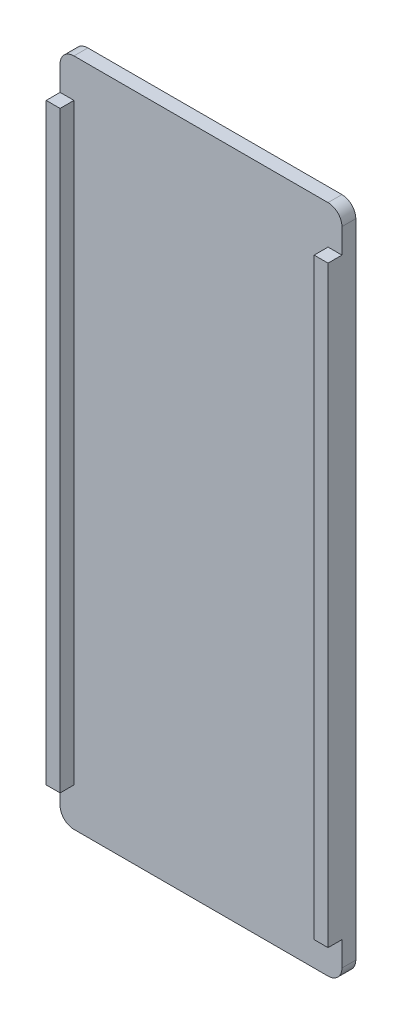
ISO-10303-21;
HEADER;
FILE_DESCRIPTION(('STEP AP214'),'2;1');
FILE_NAME('part.step','',(''),(''),'','','');
FILE_SCHEMA(('AUTOMOTIVE_DESIGN { 1 0 10303 214 1 1 1 1 }'));
ENDSEC;
DATA;
#1=APPLICATION_CONTEXT('core data for automotive mechanical design processes');
#2=APPLICATION_PROTOCOL_DEFINITION('international standard','automotive_design',2000,#1);
#3=PRODUCT_CONTEXT('',#1,'mechanical');
#4=PRODUCT('Part','Part','',(#3));
#5=PRODUCT_RELATED_PRODUCT_CATEGORY('part','',(#4));
#6=PRODUCT_DEFINITION_FORMATION('','',#4);
#7=PRODUCT_DEFINITION_CONTEXT('part definition',#1,'design');
#8=PRODUCT_DEFINITION('design','',#6,#7);
#9=PRODUCT_DEFINITION_SHAPE('','',#8);
#10=(LENGTH_UNIT() NAMED_UNIT(*) SI_UNIT(.MILLI.,.METRE.));
#11=(NAMED_UNIT(*) PLANE_ANGLE_UNIT() SI_UNIT($,.RADIAN.));
#12=(NAMED_UNIT(*) SI_UNIT($,.STERADIAN.) SOLID_ANGLE_UNIT());
#13=UNCERTAINTY_MEASURE_WITH_UNIT(LENGTH_MEASURE(1.E-05),#10,'distance_accuracy_value','');
#14=(GEOMETRIC_REPRESENTATION_CONTEXT(3) GLOBAL_UNCERTAINTY_ASSIGNED_CONTEXT((#13)) GLOBAL_UNIT_ASSIGNED_CONTEXT((#10,
#11,#12)) REPRESENTATION_CONTEXT('',''));
#15=CARTESIAN_POINT('',(0.,0.,0.));
#16=DIRECTION('',(0.,0.,1.));
#17=DIRECTION('',(1.,0.,0.));
#18=AXIS2_PLACEMENT_3D('',#15,#16,#17);
#19=CARTESIAN_POINT('',(-18.3,-46.25,2.));
#20=DIRECTION('',(0.,0.,-1.));
#21=DIRECTION('',(-1.,0.,0.));
#22=AXIS2_PLACEMENT_3D('',#19,#20,#21);
#23=PLANE('',#22);
#24=DIRECTION('',(1.,0.,0.));
#25=VECTOR('',#24,1.);
#26=CARTESIAN_POINT('',(0.,-42.7,2.));
#27=LINE('',#26,#25);
#28=CARTESIAN_POINT('',(-20.3,-42.7,2.));
#29=VERTEX_POINT('',#28);
#30=CARTESIAN_POINT('',(-18.3,-42.7,2.));
#31=VERTEX_POINT('',#30);
#32=EDGE_CURVE('E170',#29,#31,#27,.T.);
#33=ORIENTED_EDGE('',*,*,#32,.F.);
#34=DIRECTION('',(0.,-1.,0.));
#35=VECTOR('',#34,1.);
#36=CARTESIAN_POINT('',(-20.3,-46.25,2.));
#37=LINE('',#36,#35);
#38=CARTESIAN_POINT('',(-20.3,-46.25,2.));
#39=VERTEX_POINT('',#38);
#40=EDGE_CURVE('E233',#29,#39,#37,.T.);
#41=ORIENTED_EDGE('',*,*,#40,.T.);
#42=CARTESIAN_POINT('',(-18.3,-46.25,2.));
#43=DIRECTION('',(0.,0.,1.));
#44=DIRECTION('',(-1.,0.,0.));
#45=AXIS2_PLACEMENT_3D('',#42,#43,#44);
#46=CIRCLE('',#45,2.);
#47=CARTESIAN_POINT('',(-18.3,-48.25,2.));
#48=VERTEX_POINT('',#47);
#49=EDGE_CURVE('E216',#39,#48,#46,.T.);
#50=ORIENTED_EDGE('',*,*,#49,.T.);
#51=DIRECTION('',(1.,0.,0.));
#52=VECTOR('',#51,1.);
#53=CARTESIAN_POINT('',(-18.3,-48.25,2.));
#54=LINE('',#53,#52);
#55=CARTESIAN_POINT('',(18.3,-48.25,2.));
#56=VERTEX_POINT('',#55);
#57=EDGE_CURVE('E219',#48,#56,#54,.T.);
#58=ORIENTED_EDGE('',*,*,#57,.T.);
#59=CARTESIAN_POINT('',(18.3,-46.25,2.));
#60=DIRECTION('',(0.,0.,1.));
#61=DIRECTION('',(-1.,0.,0.));
#62=AXIS2_PLACEMENT_3D('',#59,#60,#61);
#63=CIRCLE('',#62,2.);
#64=CARTESIAN_POINT('',(20.3,-46.25,2.));
#65=VERTEX_POINT('',#64);
#66=EDGE_CURVE('E222',#56,#65,#63,.T.);
#67=ORIENTED_EDGE('',*,*,#66,.T.);
#68=DIRECTION('',(0.,1.,0.));
#69=VECTOR('',#68,1.);
#70=CARTESIAN_POINT('',(20.3,-46.25,2.));
#71=LINE('',#70,#69);
#72=CARTESIAN_POINT('',(20.3,-42.7,2.));
#73=VERTEX_POINT('',#72);
#74=EDGE_CURVE('E225',#65,#73,#71,.T.);
#75=ORIENTED_EDGE('',*,*,#74,.T.);
#76=DIRECTION('',(-1.,0.,0.));
#77=VECTOR('',#76,1.);
#78=CARTESIAN_POINT('',(0.,-42.7,2.));
#79=LINE('',#78,#77);
#80=CARTESIAN_POINT('',(18.3,-42.7,2.));
#81=VERTEX_POINT('',#80);
#82=EDGE_CURVE('E194',#73,#81,#79,.T.);
#83=ORIENTED_EDGE('',*,*,#82,.T.);
#84=DIRECTION('',(0.,-1.,0.));
#85=VECTOR('',#84,1.);
#86=CARTESIAN_POINT('',(18.3,0.,2.));
#87=LINE('',#86,#85);
#88=CARTESIAN_POINT('',(18.3,42.7,2.));
#89=VERTEX_POINT('',#88);
#90=EDGE_CURVE('E64',#89,#81,#87,.T.);
#91=ORIENTED_EDGE('',*,*,#90,.F.);
#92=DIRECTION('',(-1.,0.,0.));
#93=VECTOR('',#92,1.);
#94=CARTESIAN_POINT('',(0.,42.7,2.));
#95=LINE('',#94,#93);
#96=CARTESIAN_POINT('',(20.3,42.7,2.));
#97=VERTEX_POINT('',#96);
#98=EDGE_CURVE('E202',#97,#89,#95,.T.);
#99=ORIENTED_EDGE('',*,*,#98,.F.);
#100=CARTESIAN_POINT('',(20.3,46.25,2.));
#101=VERTEX_POINT('',#100);
#102=EDGE_CURVE('E224',#97,#101,#71,.T.);
#103=ORIENTED_EDGE('',*,*,#102,.T.);
#104=CARTESIAN_POINT('',(18.3,46.25,2.));
#105=DIRECTION('',(0.,0.,1.));
#106=DIRECTION('',(1.,0.,0.));
#107=AXIS2_PLACEMENT_3D('',#104,#105,#106);
#108=CIRCLE('',#107,2.);
#109=CARTESIAN_POINT('',(18.3,48.25,2.));
#110=VERTEX_POINT('',#109);
#111=EDGE_CURVE('E227',#101,#110,#108,.T.);
#112=ORIENTED_EDGE('',*,*,#111,.T.);
#113=DIRECTION('',(-1.,0.,0.));
#114=VECTOR('',#113,1.);
#115=CARTESIAN_POINT('',(-18.3,48.25,2.));
#116=LINE('',#115,#114);
#117=CARTESIAN_POINT('',(-18.3,48.25,2.));
#118=VERTEX_POINT('',#117);
#119=EDGE_CURVE('E229',#110,#118,#116,.T.);
#120=ORIENTED_EDGE('',*,*,#119,.T.);
#121=CARTESIAN_POINT('',(-18.3,46.25,2.));
#122=DIRECTION('',(0.,0.,1.));
#123=DIRECTION('',(1.,0.,0.));
#124=AXIS2_PLACEMENT_3D('',#121,#122,#123);
#125=CIRCLE('',#124,2.);
#126=CARTESIAN_POINT('',(-20.3,46.25,2.));
#127=VERTEX_POINT('',#126);
#128=EDGE_CURVE('E231',#118,#127,#125,.T.);
#129=ORIENTED_EDGE('',*,*,#128,.T.);
#130=CARTESIAN_POINT('',(-20.3,42.7,2.));
#131=VERTEX_POINT('',#130);
#132=EDGE_CURVE('E234',#127,#131,#37,.T.);
#133=ORIENTED_EDGE('',*,*,#132,.T.);
#134=DIRECTION('',(1.,0.,0.));
#135=VECTOR('',#134,1.);
#136=CARTESIAN_POINT('',(0.,42.7,2.));
#137=LINE('',#136,#135);
#138=CARTESIAN_POINT('',(-18.3,42.7,2.));
#139=VERTEX_POINT('',#138);
#140=EDGE_CURVE('E181',#131,#139,#137,.T.);
#141=ORIENTED_EDGE('',*,*,#140,.T.);
#142=DIRECTION('',(0.,-1.,0.));
#143=VECTOR('',#142,1.);
#144=CARTESIAN_POINT('',(-18.3,0.,2.));
#145=LINE('',#144,#143);
#146=EDGE_CURVE('E56',#139,#31,#145,.T.);
#147=ORIENTED_EDGE('',*,*,#146,.T.);
#148=EDGE_LOOP('',(#33,#41,#50,#58,#67,#75,#83,#91,#99,#103,#112,#120,#129,#133,#141,#147));
#149=FACE_BOUND('',#148,.T.);
#150=ADVANCED_FACE('F41',(#149),#23,.F.);
#151=CARTESIAN_POINT('',(-18.3,-46.25,2.));
#152=DIRECTION('',(0.,0.,-1.));
#153=DIRECTION('',(-1.,0.,0.));
#154=AXIS2_PLACEMENT_3D('',#151,#152,#153);
#155=CYLINDRICAL_SURFACE('',#154,2.);
#156=CARTESIAN_POINT('',(-18.3,-46.25,0.));
#157=DIRECTION('',(0.,0.,1.));
#158=DIRECTION('',(-1.,0.,0.));
#159=AXIS2_PLACEMENT_3D('',#156,#157,#158);
#160=CIRCLE('',#159,2.);
#161=CARTESIAN_POINT('',(-20.3,-46.25,0.));
#162=VERTEX_POINT('',#161);
#163=CARTESIAN_POINT('',(-18.3,-48.25,0.));
#164=VERTEX_POINT('',#163);
#165=EDGE_CURVE('E160',#162,#164,#160,.T.);
#166=ORIENTED_EDGE('',*,*,#165,.T.);
#167=DIRECTION('',(0.,0.,-1.));
#168=VECTOR('',#167,1.);
#169=CARTESIAN_POINT('',(-18.3,-48.25,2.));
#170=LINE('',#169,#168);
#171=EDGE_CURVE('E11',#48,#164,#170,.T.);
#172=ORIENTED_EDGE('',*,*,#171,.F.);
#173=ORIENTED_EDGE('',*,*,#49,.F.);
#174=DIRECTION('',(0.,0.,-1.));
#175=VECTOR('',#174,1.);
#176=CARTESIAN_POINT('',(-20.3,-46.25,2.));
#177=LINE('',#176,#175);
#178=EDGE_CURVE('E237',#39,#162,#177,.T.);
#179=ORIENTED_EDGE('',*,*,#178,.T.);
#180=EDGE_LOOP('',(#166,#172,#173,#179));
#181=FACE_BOUND('',#180,.T.);
#182=ADVANCED_FACE('F43',(#181),#155,.T.);
#183=CARTESIAN_POINT('',(-18.3,-48.25,2.));
#184=DIRECTION('',(0.,1.,0.));
#185=DIRECTION('',(0.,0.,1.));
#186=AXIS2_PLACEMENT_3D('',#183,#184,#185);
#187=PLANE('',#186);
#188=DIRECTION('',(1.,0.,0.));
#189=VECTOR('',#188,1.);
#190=CARTESIAN_POINT('',(-18.3,-48.25,0.));
#191=LINE('',#190,#189);
#192=CARTESIAN_POINT('',(18.3,-48.25,0.));
#193=VERTEX_POINT('',#192);
#194=EDGE_CURVE('E240',#164,#193,#191,.T.);
#195=ORIENTED_EDGE('',*,*,#194,.T.);
#196=DIRECTION('',(0.,0.,-1.));
#197=VECTOR('',#196,1.);
#198=CARTESIAN_POINT('',(18.3,-48.25,2.));
#199=LINE('',#198,#197);
#200=EDGE_CURVE('E49',#56,#193,#199,.T.);
#201=ORIENTED_EDGE('',*,*,#200,.F.);
#202=ORIENTED_EDGE('',*,*,#57,.F.);
#203=ORIENTED_EDGE('',*,*,#171,.T.);
#204=EDGE_LOOP('',(#195,#201,#202,#203));
#205=FACE_BOUND('',#204,.T.);
#206=ADVANCED_FACE('F310',(#205),#187,.F.);
#207=CARTESIAN_POINT('',(18.3,-46.25,2.));
#208=DIRECTION('',(0.,0.,-1.));
#209=DIRECTION('',(-1.,0.,0.));
#210=AXIS2_PLACEMENT_3D('',#207,#208,#209);
#211=CYLINDRICAL_SURFACE('',#210,2.);
#212=CARTESIAN_POINT('',(18.3,-46.25,0.));
#213=DIRECTION('',(0.,0.,1.));
#214=DIRECTION('',(-1.,0.,0.));
#215=AXIS2_PLACEMENT_3D('',#212,#213,#214);
#216=CIRCLE('',#215,2.);
#217=CARTESIAN_POINT('',(20.3,-46.25,0.));
#218=VERTEX_POINT('',#217);
#219=EDGE_CURVE('E242',#193,#218,#216,.T.);
#220=ORIENTED_EDGE('',*,*,#219,.T.);
#221=DIRECTION('',(0.,0.,-1.));
#222=VECTOR('',#221,1.);
#223=CARTESIAN_POINT('',(20.3,-46.25,2.));
#224=LINE('',#223,#222);
#225=EDGE_CURVE('E267',#65,#218,#224,.T.);
#226=ORIENTED_EDGE('',*,*,#225,.F.);
#227=ORIENTED_EDGE('',*,*,#66,.F.);
#228=ORIENTED_EDGE('',*,*,#200,.T.);
#229=EDGE_LOOP('',(#220,#226,#227,#228));
#230=FACE_BOUND('',#229,.T.);
#231=ADVANCED_FACE('F274',(#230),#211,.T.);
#232=CARTESIAN_POINT('',(20.3,-46.25,2.));
#233=DIRECTION('',(-1.,0.,0.));
#234=DIRECTION('',(0.,0.,1.));
#235=AXIS2_PLACEMENT_3D('',#232,#233,#234);
#236=PLANE('',#235);
#237=DIRECTION('',(0.,1.,0.));
#238=VECTOR('',#237,1.);
#239=CARTESIAN_POINT('',(20.3,-46.25,0.));
#240=LINE('',#239,#238);
#241=CARTESIAN_POINT('',(20.3,46.25,0.));
#242=VERTEX_POINT('',#241);
#243=EDGE_CURVE('E244',#218,#242,#240,.T.);
#244=ORIENTED_EDGE('',*,*,#243,.T.);
#245=DIRECTION('',(0.,0.,-1.));
#246=VECTOR('',#245,1.);
#247=CARTESIAN_POINT('',(20.3,46.25,2.));
#248=LINE('',#247,#246);
#249=EDGE_CURVE('E264',#101,#242,#248,.T.);
#250=ORIENTED_EDGE('',*,*,#249,.F.);
#251=ORIENTED_EDGE('',*,*,#102,.F.);
#252=DIRECTION('',(0.,0.,-1.));
#253=VECTOR('',#252,1.);
#254=CARTESIAN_POINT('',(20.3,42.7,4.));
#255=LINE('',#254,#253);
#256=CARTESIAN_POINT('',(20.3,42.7,4.));
#257=VERTEX_POINT('',#256);
#258=EDGE_CURVE('E201',#257,#97,#255,.T.);
#259=ORIENTED_EDGE('',*,*,#258,.F.);
#260=DIRECTION('',(0.,1.,0.));
#261=VECTOR('',#260,1.);
#262=CARTESIAN_POINT('',(20.3,0.,4.));
#263=LINE('',#262,#261);
#264=CARTESIAN_POINT('',(20.3,-42.7,4.));
#265=VERTEX_POINT('',#264);
#266=EDGE_CURVE('E199',#265,#257,#263,.T.);
#267=ORIENTED_EDGE('',*,*,#266,.F.);
#268=DIRECTION('',(0.,0.,-1.));
#269=VECTOR('',#268,1.);
#270=CARTESIAN_POINT('',(20.3,-42.7,4.));
#271=LINE('',#270,#269);
#272=EDGE_CURVE('E209',#265,#73,#271,.T.);
#273=ORIENTED_EDGE('',*,*,#272,.T.);
#274=ORIENTED_EDGE('',*,*,#74,.F.);
#275=ORIENTED_EDGE('',*,*,#225,.T.);
#276=EDGE_LOOP('',(#244,#250,#251,#259,#267,#273,#274,#275));
#277=FACE_BOUND('',#276,.T.);
#278=ADVANCED_FACE('F285',(#277),#236,.F.);
#279=CARTESIAN_POINT('',(18.3,46.25,2.));
#280=DIRECTION('',(0.,0.,-1.));
#281=DIRECTION('',(-1.,0.,0.));
#282=AXIS2_PLACEMENT_3D('',#279,#280,#281);
#283=CYLINDRICAL_SURFACE('',#282,2.);
#284=CARTESIAN_POINT('',(18.3,46.25,0.));
#285=DIRECTION('',(0.,0.,1.));
#286=DIRECTION('',(1.,0.,0.));
#287=AXIS2_PLACEMENT_3D('',#284,#285,#286);
#288=CIRCLE('',#287,2.);
#289=CARTESIAN_POINT('',(18.3,48.25,0.));
#290=VERTEX_POINT('',#289);
#291=EDGE_CURVE('E246',#242,#290,#288,.T.);
#292=ORIENTED_EDGE('',*,*,#291,.T.);
#293=DIRECTION('',(0.,0.,-1.));
#294=VECTOR('',#293,1.);
#295=CARTESIAN_POINT('',(18.3,48.25,2.));
#296=LINE('',#295,#294);
#297=EDGE_CURVE('E261',#110,#290,#296,.T.);
#298=ORIENTED_EDGE('',*,*,#297,.F.);
#299=ORIENTED_EDGE('',*,*,#111,.F.);
#300=ORIENTED_EDGE('',*,*,#249,.T.);
#301=EDGE_LOOP('',(#292,#298,#299,#300));
#302=FACE_BOUND('',#301,.T.);
#303=ADVANCED_FACE('F290',(#302),#283,.T.);
#304=CARTESIAN_POINT('',(-18.3,48.25,2.));
#305=DIRECTION('',(0.,-1.,0.));
#306=DIRECTION('',(0.,0.,-1.));
#307=AXIS2_PLACEMENT_3D('',#304,#305,#306);
#308=PLANE('',#307);
#309=DIRECTION('',(-1.,0.,0.));
#310=VECTOR('',#309,1.);
#311=CARTESIAN_POINT('',(-18.3,48.25,0.));
#312=LINE('',#311,#310);
#313=CARTESIAN_POINT('',(-18.3,48.25,0.));
#314=VERTEX_POINT('',#313);
#315=EDGE_CURVE('E248',#290,#314,#312,.T.);
#316=ORIENTED_EDGE('',*,*,#315,.T.);
#317=DIRECTION('',(0.,0.,-1.));
#318=VECTOR('',#317,1.);
#319=CARTESIAN_POINT('',(-18.3,48.25,2.));
#320=LINE('',#319,#318);
#321=EDGE_CURVE('E258',#118,#314,#320,.T.);
#322=ORIENTED_EDGE('',*,*,#321,.F.);
#323=ORIENTED_EDGE('',*,*,#119,.F.);
#324=ORIENTED_EDGE('',*,*,#297,.T.);
#325=EDGE_LOOP('',(#316,#322,#323,#324));
#326=FACE_BOUND('',#325,.T.);
#327=ADVANCED_FACE('F324',(#326),#308,.F.);
#328=CARTESIAN_POINT('',(-18.3,46.25,2.));
#329=DIRECTION('',(0.,0.,-1.));
#330=DIRECTION('',(-1.,0.,0.));
#331=AXIS2_PLACEMENT_3D('',#328,#329,#330);
#332=CYLINDRICAL_SURFACE('',#331,2.);
#333=CARTESIAN_POINT('',(-18.3,46.25,0.));
#334=DIRECTION('',(0.,0.,1.));
#335=DIRECTION('',(1.,0.,0.));
#336=AXIS2_PLACEMENT_3D('',#333,#334,#335);
#337=CIRCLE('',#336,2.);
#338=CARTESIAN_POINT('',(-20.3,46.25,0.));
#339=VERTEX_POINT('',#338);
#340=EDGE_CURVE('E250',#314,#339,#337,.T.);
#341=ORIENTED_EDGE('',*,*,#340,.T.);
#342=DIRECTION('',(0.,0.,-1.));
#343=VECTOR('',#342,1.);
#344=CARTESIAN_POINT('',(-20.3,46.25,2.));
#345=LINE('',#344,#343);
#346=EDGE_CURVE('E255',#127,#339,#345,.T.);
#347=ORIENTED_EDGE('',*,*,#346,.F.);
#348=ORIENTED_EDGE('',*,*,#128,.F.);
#349=ORIENTED_EDGE('',*,*,#321,.T.);
#350=EDGE_LOOP('',(#341,#347,#348,#349));
#351=FACE_BOUND('',#350,.T.);
#352=ADVANCED_FACE('F322',(#351),#332,.T.);
#353=CARTESIAN_POINT('',(-20.3,-46.25,2.));
#354=DIRECTION('',(1.,0.,0.));
#355=DIRECTION('',(0.,0.,-1.));
#356=AXIS2_PLACEMENT_3D('',#353,#354,#355);
#357=PLANE('',#356);
#358=DIRECTION('',(0.,-1.,0.));
#359=VECTOR('',#358,1.);
#360=CARTESIAN_POINT('',(-20.3,-46.25,0.));
#361=LINE('',#360,#359);
#362=EDGE_CURVE('E220',#339,#162,#361,.T.);
#363=ORIENTED_EDGE('',*,*,#362,.T.);
#364=ORIENTED_EDGE('',*,*,#178,.F.);
#365=ORIENTED_EDGE('',*,*,#40,.F.);
#366=DIRECTION('',(0.,0.,-1.));
#367=VECTOR('',#366,1.);
#368=CARTESIAN_POINT('',(-20.3,-42.7,4.));
#369=LINE('',#368,#367);
#370=CARTESIAN_POINT('',(-20.3,-42.7,4.));
#371=VERTEX_POINT('',#370);
#372=EDGE_CURVE('E187',#371,#29,#369,.T.);
#373=ORIENTED_EDGE('',*,*,#372,.F.);
#374=DIRECTION('',(0.,-1.,0.));
#375=VECTOR('',#374,1.);
#376=CARTESIAN_POINT('',(-20.3,0.,4.));
#377=LINE('',#376,#375);
#378=CARTESIAN_POINT('',(-20.3,42.7,4.));
#379=VERTEX_POINT('',#378);
#380=EDGE_CURVE('E174',#379,#371,#377,.T.);
#381=ORIENTED_EDGE('',*,*,#380,.F.);
#382=DIRECTION('',(0.,0.,-1.));
#383=VECTOR('',#382,1.);
#384=CARTESIAN_POINT('',(-20.3,42.7,4.));
#385=LINE('',#384,#383);
#386=EDGE_CURVE('E161',#379,#131,#385,.T.);
#387=ORIENTED_EDGE('',*,*,#386,.T.);
#388=ORIENTED_EDGE('',*,*,#132,.F.);
#389=ORIENTED_EDGE('',*,*,#346,.T.);
#390=EDGE_LOOP('',(#363,#364,#365,#373,#381,#387,#388,#389));
#391=FACE_BOUND('',#390,.T.);
#392=ADVANCED_FACE('F316',(#391),#357,.F.);
#393=CARTESIAN_POINT('',(-18.3,-46.25,0.));
#394=DIRECTION('',(0.,0.,-1.));
#395=DIRECTION('',(-1.,0.,0.));
#396=AXIS2_PLACEMENT_3D('',#393,#394,#395);
#397=PLANE('',#396);
#398=ORIENTED_EDGE('',*,*,#165,.F.);
#399=ORIENTED_EDGE('',*,*,#362,.F.);
#400=ORIENTED_EDGE('',*,*,#340,.F.);
#401=ORIENTED_EDGE('',*,*,#315,.F.);
#402=ORIENTED_EDGE('',*,*,#291,.F.);
#403=ORIENTED_EDGE('',*,*,#243,.F.);
#404=ORIENTED_EDGE('',*,*,#219,.F.);
#405=ORIENTED_EDGE('',*,*,#194,.F.);
#406=EDGE_LOOP('',(#398,#399,#400,#401,#402,#403,#404,#405));
#407=FACE_BOUND('',#406,.T.);
#408=ADVANCED_FACE('F280',(#407),#397,.T.);
#409=CARTESIAN_POINT('',(0.,42.7,4.));
#410=DIRECTION('',(0.,-1.,0.));
#411=DIRECTION('',(0.,0.,-1.));
#412=AXIS2_PLACEMENT_3D('',#409,#410,#411);
#413=PLANE('',#412);
#414=ORIENTED_EDGE('',*,*,#98,.T.);
#415=DIRECTION('',(0.,0.,-1.));
#416=VECTOR('',#415,1.);
#417=CARTESIAN_POINT('',(18.3,42.7,4.));
#418=LINE('',#417,#416);
#419=CARTESIAN_POINT('',(18.3,42.7,4.));
#420=VERTEX_POINT('',#419);
#421=EDGE_CURVE('E182',#420,#89,#418,.T.);
#422=ORIENTED_EDGE('',*,*,#421,.F.);
#423=DIRECTION('',(-1.,0.,0.));
#424=VECTOR('',#423,1.);
#425=CARTESIAN_POINT('',(0.,42.7,4.));
#426=LINE('',#425,#424);
#427=EDGE_CURVE('E190',#257,#420,#426,.T.);
#428=ORIENTED_EDGE('',*,*,#427,.F.);
#429=ORIENTED_EDGE('',*,*,#258,.T.);
#430=EDGE_LOOP('',(#414,#422,#428,#429));
#431=FACE_BOUND('',#430,.T.);
#432=ADVANCED_FACE('F299',(#431),#413,.F.);
#433=CARTESIAN_POINT('',(18.3,0.,4.));
#434=DIRECTION('',(1.,0.,0.));
#435=DIRECTION('',(0.,1.,0.));
#436=AXIS2_PLACEMENT_3D('',#433,#434,#435);
#437=PLANE('',#436);
#438=ORIENTED_EDGE('',*,*,#90,.T.);
#439=DIRECTION('',(0.,0.,-1.));
#440=VECTOR('',#439,1.);
#441=CARTESIAN_POINT('',(18.3,-42.7,4.));
#442=LINE('',#441,#440);
#443=CARTESIAN_POINT('',(18.3,-42.7,4.));
#444=VERTEX_POINT('',#443);
#445=EDGE_CURVE('E212',#444,#81,#442,.T.);
#446=ORIENTED_EDGE('',*,*,#445,.F.);
#447=DIRECTION('',(0.,-1.,0.));
#448=VECTOR('',#447,1.);
#449=CARTESIAN_POINT('',(18.3,0.,4.));
#450=LINE('',#449,#448);
#451=EDGE_CURVE('E193',#420,#444,#450,.T.);
#452=ORIENTED_EDGE('',*,*,#451,.F.);
#453=ORIENTED_EDGE('',*,*,#421,.T.);
#454=EDGE_LOOP('',(#438,#446,#452,#453));
#455=FACE_BOUND('',#454,.T.);
#456=ADVANCED_FACE('F356',(#455),#437,.F.);
#457=CARTESIAN_POINT('',(0.,-42.7,4.));
#458=DIRECTION('',(0.,-1.,0.));
#459=DIRECTION('',(0.,0.,-1.));
#460=AXIS2_PLACEMENT_3D('',#457,#458,#459);
#461=PLANE('',#460);
#462=ORIENTED_EDGE('',*,*,#82,.F.);
#463=ORIENTED_EDGE('',*,*,#272,.F.);
#464=DIRECTION('',(-1.,0.,0.));
#465=VECTOR('',#464,1.);
#466=CARTESIAN_POINT('',(0.,-42.7,4.));
#467=LINE('',#466,#465);
#468=EDGE_CURVE('E196',#265,#444,#467,.T.);
#469=ORIENTED_EDGE('',*,*,#468,.T.);
#470=ORIENTED_EDGE('',*,*,#445,.T.);
#471=EDGE_LOOP('',(#462,#463,#469,#470));
#472=FACE_BOUND('',#471,.T.);
#473=ADVANCED_FACE('F307',(#472),#461,.T.);
#474=CARTESIAN_POINT('',(0.,0.,4.));
#475=DIRECTION('',(0.,0.,1.));
#476=DIRECTION('',(1.,0.,0.));
#477=AXIS2_PLACEMENT_3D('',#474,#475,#476);
#478=PLANE('',#477);
#479=ORIENTED_EDGE('',*,*,#427,.T.);
#480=ORIENTED_EDGE('',*,*,#451,.T.);
#481=ORIENTED_EDGE('',*,*,#468,.F.);
#482=ORIENTED_EDGE('',*,*,#266,.T.);
#483=EDGE_LOOP('',(#479,#480,#481,#482));
#484=FACE_BOUND('',#483,.T.);
#485=ADVANCED_FACE('F302',(#484),#478,.T.);
#486=CARTESIAN_POINT('',(-18.3,0.,4.));
#487=DIRECTION('',(1.,0.,0.));
#488=DIRECTION('',(0.,1.,0.));
#489=AXIS2_PLACEMENT_3D('',#486,#487,#488);
#490=PLANE('',#489);
#491=ORIENTED_EDGE('',*,*,#146,.F.);
#492=DIRECTION('',(0.,0.,-1.));
#493=VECTOR('',#492,1.);
#494=CARTESIAN_POINT('',(-18.3,42.7,4.));
#495=LINE('',#494,#493);
#496=CARTESIAN_POINT('',(-18.3,42.7,4.));
#497=VERTEX_POINT('',#496);
#498=EDGE_CURVE('E152',#497,#139,#495,.T.);
#499=ORIENTED_EDGE('',*,*,#498,.F.);
#500=DIRECTION('',(0.,-1.,0.));
#501=VECTOR('',#500,1.);
#502=CARTESIAN_POINT('',(-18.3,0.,4.));
#503=LINE('',#502,#501);
#504=CARTESIAN_POINT('',(-18.3,-42.7,4.));
#505=VERTEX_POINT('',#504);
#506=EDGE_CURVE('E155',#497,#505,#503,.T.);
#507=ORIENTED_EDGE('',*,*,#506,.T.);
#508=DIRECTION('',(0.,0.,-1.));
#509=VECTOR('',#508,1.);
#510=CARTESIAN_POINT('',(-18.3,-42.7,4.));
#511=LINE('',#510,#509);
#512=EDGE_CURVE('E179',#505,#31,#511,.T.);
#513=ORIENTED_EDGE('',*,*,#512,.T.);
#514=EDGE_LOOP('',(#491,#499,#507,#513));
#515=FACE_BOUND('',#514,.T.);
#516=ADVANCED_FACE('F154',(#515),#490,.T.);
#517=CARTESIAN_POINT('',(0.,42.7,4.));
#518=DIRECTION('',(0.,1.,0.));
#519=DIRECTION('',(0.,0.,1.));
#520=AXIS2_PLACEMENT_3D('',#517,#518,#519);
#521=PLANE('',#520);
#522=ORIENTED_EDGE('',*,*,#140,.F.);
#523=ORIENTED_EDGE('',*,*,#386,.F.);
#524=DIRECTION('',(1.,0.,0.));
#525=VECTOR('',#524,1.);
#526=CARTESIAN_POINT('',(0.,42.7,4.));
#527=LINE('',#526,#525);
#528=EDGE_CURVE('E166',#379,#497,#527,.T.);
#529=ORIENTED_EDGE('',*,*,#528,.T.);
#530=ORIENTED_EDGE('',*,*,#498,.T.);
#531=EDGE_LOOP('',(#522,#523,#529,#530));
#532=FACE_BOUND('',#531,.T.);
#533=ADVANCED_FACE('F172',(#532),#521,.T.);
#534=CARTESIAN_POINT('',(0.,-42.7,4.));
#535=DIRECTION('',(0.,1.,0.));
#536=DIRECTION('',(0.,0.,1.));
#537=AXIS2_PLACEMENT_3D('',#534,#535,#536);
#538=PLANE('',#537);
#539=ORIENTED_EDGE('',*,*,#32,.T.);
#540=ORIENTED_EDGE('',*,*,#512,.F.);
#541=DIRECTION('',(1.,0.,0.));
#542=VECTOR('',#541,1.);
#543=CARTESIAN_POINT('',(0.,-42.7,4.));
#544=LINE('',#543,#542);
#545=EDGE_CURVE('E168',#371,#505,#544,.T.);
#546=ORIENTED_EDGE('',*,*,#545,.F.);
#547=ORIENTED_EDGE('',*,*,#372,.T.);
#548=EDGE_LOOP('',(#539,#540,#546,#547));
#549=FACE_BOUND('',#548,.T.);
#550=ADVANCED_FACE('F391',(#549),#538,.F.);
#551=CARTESIAN_POINT('',(0.,0.,4.));
#552=DIRECTION('',(0.,0.,1.));
#553=DIRECTION('',(1.,0.,0.));
#554=AXIS2_PLACEMENT_3D('',#551,#552,#553);
#555=PLANE('',#554);
#556=ORIENTED_EDGE('',*,*,#506,.F.);
#557=ORIENTED_EDGE('',*,*,#528,.F.);
#558=ORIENTED_EDGE('',*,*,#380,.T.);
#559=ORIENTED_EDGE('',*,*,#545,.T.);
#560=EDGE_LOOP('',(#556,#557,#558,#559));
#561=FACE_BOUND('',#560,.T.);
#562=ADVANCED_FACE('F165',(#561),#555,.T.);
#563=CLOSED_SHELL('',(#150,#182,#206,#231,#278,#303,#327,#352,#392,#408,#432,#456,#473,#485,
#516,#533,#550,#562));
#564=MANIFOLD_SOLID_BREP('B2',#563);
#565=ADVANCED_BREP_SHAPE_REPRESENTATION('',(#18,#564),#14);
#566=SHAPE_DEFINITION_REPRESENTATION(#9,#565);
ENDSEC;
END-ISO-10303-21;
